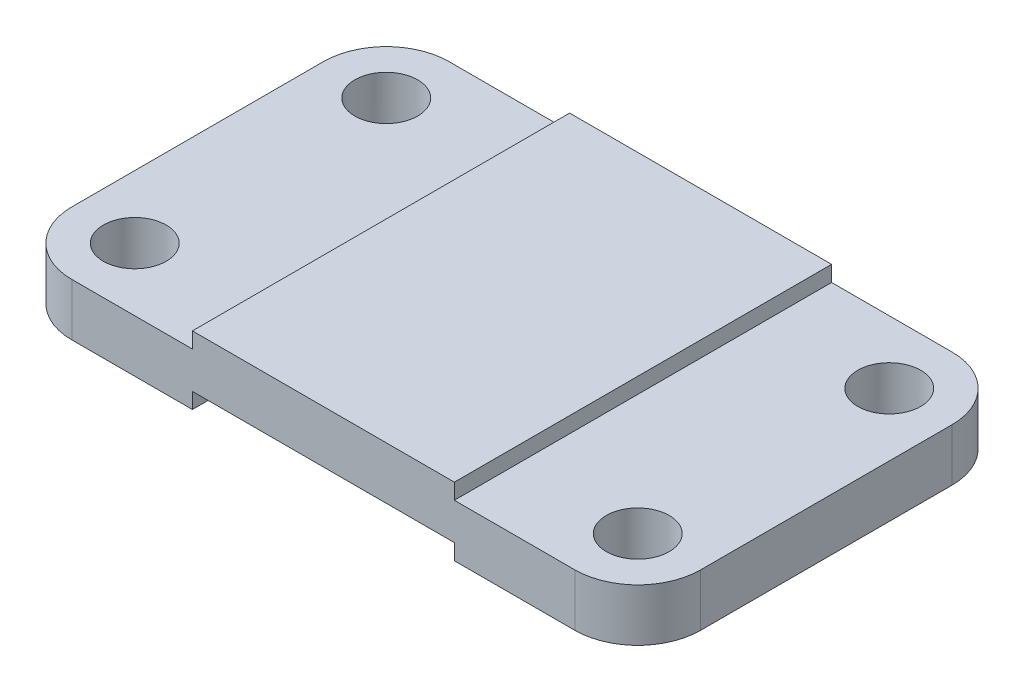
ISO-10303-21;
HEADER;
FILE_DESCRIPTION(('STEP AP214'),'2;1');
FILE_NAME('part.step','',(''),(''),'','','');
FILE_SCHEMA(('AUTOMOTIVE_DESIGN { 1 0 10303 214 1 1 1 1 }'));
ENDSEC;
DATA;
#1=APPLICATION_CONTEXT('core data for automotive mechanical design processes');
#2=APPLICATION_PROTOCOL_DEFINITION('international standard','automotive_design',2000,#1);
#3=PRODUCT_CONTEXT('',#1,'mechanical');
#4=PRODUCT('Part','Part','',(#3));
#5=PRODUCT_RELATED_PRODUCT_CATEGORY('part','',(#4));
#6=PRODUCT_DEFINITION_FORMATION('','',#4);
#7=PRODUCT_DEFINITION_CONTEXT('part definition',#1,'design');
#8=PRODUCT_DEFINITION('design','',#6,#7);
#9=PRODUCT_DEFINITION_SHAPE('','',#8);
#10=(LENGTH_UNIT() NAMED_UNIT(*) SI_UNIT(.MILLI.,.METRE.));
#11=(NAMED_UNIT(*) PLANE_ANGLE_UNIT() SI_UNIT($,.RADIAN.));
#12=(NAMED_UNIT(*) SI_UNIT($,.STERADIAN.) SOLID_ANGLE_UNIT());
#13=UNCERTAINTY_MEASURE_WITH_UNIT(LENGTH_MEASURE(1.E-05),#10,'distance_accuracy_value','');
#14=(GEOMETRIC_REPRESENTATION_CONTEXT(3) GLOBAL_UNCERTAINTY_ASSIGNED_CONTEXT((#13)) GLOBAL_UNIT_ASSIGNED_CONTEXT((#10,
#11,#12)) REPRESENTATION_CONTEXT('',''));
#15=CARTESIAN_POINT('',(0.,0.,0.));
#16=DIRECTION('',(0.,0.,1.));
#17=DIRECTION('',(1.,0.,0.));
#18=AXIS2_PLACEMENT_3D('',#15,#16,#17);
#19=CARTESIAN_POINT('',(-48.,0.,24.));
#20=DIRECTION('',(0.,-1.,0.));
#21=DIRECTION('',(0.,0.,-1.));
#22=AXIS2_PLACEMENT_3D('',#19,#20,#21);
#23=PLANE('',#22);
#24=CARTESIAN_POINT('',(-48.,0.,-24.));
#25=DIRECTION('',(0.,-1.,0.));
#26=DIRECTION('',(0.,0.,-1.));
#27=AXIS2_PLACEMENT_3D('',#24,#25,#26);
#28=CIRCLE('',#27,6.);
#29=CARTESIAN_POINT('',(-48.,0.,-30.));
#30=VERTEX_POINT('',#29);
#31=EDGE_CURVE('E227',#30,#30,#28,.T.);
#32=ORIENTED_EDGE('',*,*,#31,.F.);
#33=EDGE_LOOP('',(#32));
#34=FACE_BOUND('',#33,.T.);
#35=CARTESIAN_POINT('',(-48.,0.,24.));
#36=DIRECTION('',(0.,-1.,0.));
#37=DIRECTION('',(0.,0.,-1.));
#38=AXIS2_PLACEMENT_3D('',#35,#36,#37);
#39=CIRCLE('',#38,6.);
#40=CARTESIAN_POINT('',(-48.,0.,18.));
#41=VERTEX_POINT('',#40);
#42=EDGE_CURVE('E221',#41,#41,#39,.T.);
#43=ORIENTED_EDGE('',*,*,#42,.F.);
#44=EDGE_LOOP('',(#43));
#45=FACE_BOUND('',#44,.T.);
#46=DIRECTION('',(0.,0.,-1.));
#47=VECTOR('',#46,1.);
#48=CARTESIAN_POINT('',(-25.,0.,-36.));
#49=LINE('',#48,#47);
#50=CARTESIAN_POINT('',(-25.,0.,36.));
#51=VERTEX_POINT('',#50);
#52=CARTESIAN_POINT('',(-25.,0.,-36.));
#53=VERTEX_POINT('',#52);
#54=EDGE_CURVE('E153',#51,#53,#49,.T.);
#55=ORIENTED_EDGE('',*,*,#54,.F.);
#56=DIRECTION('',(1.,0.,0.));
#57=VECTOR('',#56,1.);
#58=CARTESIAN_POINT('',(47.9999999999999,0.,36.));
#59=LINE('',#58,#57);
#60=CARTESIAN_POINT('',(-47.9999999999999,0.,36.));
#61=VERTEX_POINT('',#60);
#62=EDGE_CURVE('E363',#61,#51,#59,.T.);
#63=ORIENTED_EDGE('',*,*,#62,.F.);
#64=CARTESIAN_POINT('',(-48.,0.,24.));
#65=DIRECTION('',(0.,1.,0.));
#66=DIRECTION('',(0.,0.,-1.));
#67=AXIS2_PLACEMENT_3D('',#64,#65,#66);
#68=CIRCLE('',#67,12.);
#69=CARTESIAN_POINT('',(-60.,0.,23.9999999999999));
#70=VERTEX_POINT('',#69);
#71=EDGE_CURVE('E359',#70,#61,#68,.T.);
#72=ORIENTED_EDGE('',*,*,#71,.F.);
#73=DIRECTION('',(0.,0.,1.));
#74=VECTOR('',#73,1.);
#75=CARTESIAN_POINT('',(-60.,0.,23.9999999999999));
#76=LINE('',#75,#74);
#77=CARTESIAN_POINT('',(-60.,0.,-23.9999999999999));
#78=VERTEX_POINT('',#77);
#79=EDGE_CURVE('E295',#78,#70,#76,.T.);
#80=ORIENTED_EDGE('',*,*,#79,.F.);
#81=CARTESIAN_POINT('',(-48.,0.,-24.));
#82=DIRECTION('',(0.,1.,0.));
#83=DIRECTION('',(0.,0.,1.));
#84=AXIS2_PLACEMENT_3D('',#81,#82,#83);
#85=CIRCLE('',#84,12.);
#86=CARTESIAN_POINT('',(-47.9999999999999,0.,-36.));
#87=VERTEX_POINT('',#86);
#88=EDGE_CURVE('E292',#87,#78,#85,.T.);
#89=ORIENTED_EDGE('',*,*,#88,.F.);
#90=DIRECTION('',(-1.,0.,0.));
#91=VECTOR('',#90,1.);
#92=CARTESIAN_POINT('',(-47.9999999999999,0.,-36.));
#93=LINE('',#92,#91);
#94=EDGE_CURVE('E293',#53,#87,#93,.T.);
#95=ORIENTED_EDGE('',*,*,#94,.F.);
#96=EDGE_LOOP('',(#55,#63,#72,#80,#89,#95));
#97=FACE_BOUND('',#96,.T.);
#98=ADVANCED_FACE('F33',(#34,#45,#97),#23,.T.);
#99=CARTESIAN_POINT('',(-48.,10.,24.));
#100=DIRECTION('',(0.,-1.,0.));
#101=DIRECTION('',(0.,0.,-1.));
#102=AXIS2_PLACEMENT_3D('',#99,#100,#101);
#103=PLANE('',#102);
#104=CARTESIAN_POINT('',(-48.,10.,-24.));
#105=DIRECTION('',(0.,1.,0.));
#106=DIRECTION('',(0.,0.,1.));
#107=AXIS2_PLACEMENT_3D('',#104,#105,#106);
#108=CIRCLE('',#107,6.);
#109=CARTESIAN_POINT('',(-48.,10.,-18.));
#110=VERTEX_POINT('',#109);
#111=EDGE_CURVE('E230',#110,#110,#108,.T.);
#112=ORIENTED_EDGE('',*,*,#111,.F.);
#113=EDGE_LOOP('',(#112));
#114=FACE_BOUND('',#113,.T.);
#115=CARTESIAN_POINT('',(-48.,10.,24.));
#116=DIRECTION('',(0.,1.,0.));
#117=DIRECTION('',(0.,0.,1.));
#118=AXIS2_PLACEMENT_3D('',#115,#116,#117);
#119=CIRCLE('',#118,6.);
#120=CARTESIAN_POINT('',(-48.,10.,30.));
#121=VERTEX_POINT('',#120);
#122=EDGE_CURVE('E224',#121,#121,#119,.T.);
#123=ORIENTED_EDGE('',*,*,#122,.F.);
#124=EDGE_LOOP('',(#123));
#125=FACE_BOUND('',#124,.T.);
#126=DIRECTION('',(0.,0.,1.));
#127=VECTOR('',#126,1.);
#128=CARTESIAN_POINT('',(-25.,10.,-36.));
#129=LINE('',#128,#127);
#130=CARTESIAN_POINT('',(-25.,10.,-36.));
#131=VERTEX_POINT('',#130);
#132=CARTESIAN_POINT('',(-24.9999999999999,10.,36.));
#133=VERTEX_POINT('',#132);
#134=EDGE_CURVE('E58',#131,#133,#129,.T.);
#135=ORIENTED_EDGE('',*,*,#134,.F.);
#136=DIRECTION('',(-1.,0.,0.));
#137=VECTOR('',#136,1.);
#138=CARTESIAN_POINT('',(-47.9999999999999,10.,-36.));
#139=LINE('',#138,#137);
#140=CARTESIAN_POINT('',(-47.9999999999999,10.,-36.));
#141=VERTEX_POINT('',#140);
#142=EDGE_CURVE('E336',#131,#141,#139,.T.);
#143=ORIENTED_EDGE('',*,*,#142,.T.);
#144=CARTESIAN_POINT('',(-48.,10.,-24.));
#145=DIRECTION('',(0.,1.,0.));
#146=DIRECTION('',(0.,0.,1.));
#147=AXIS2_PLACEMENT_3D('',#144,#145,#146);
#148=CIRCLE('',#147,12.);
#149=CARTESIAN_POINT('',(-60.,10.,-23.9999999999999));
#150=VERTEX_POINT('',#149);
#151=EDGE_CURVE('E339',#141,#150,#148,.T.);
#152=ORIENTED_EDGE('',*,*,#151,.T.);
#153=DIRECTION('',(0.,0.,1.));
#154=VECTOR('',#153,1.);
#155=CARTESIAN_POINT('',(-60.,10.,23.9999999999999));
#156=LINE('',#155,#154);
#157=CARTESIAN_POINT('',(-60.,10.,23.9999999999999));
#158=VERTEX_POINT('',#157);
#159=EDGE_CURVE('E307',#150,#158,#156,.T.);
#160=ORIENTED_EDGE('',*,*,#159,.T.);
#161=CARTESIAN_POINT('',(-48.,10.,24.));
#162=DIRECTION('',(0.,1.,0.));
#163=DIRECTION('',(0.,0.,-1.));
#164=AXIS2_PLACEMENT_3D('',#161,#162,#163);
#165=CIRCLE('',#164,12.);
#166=CARTESIAN_POINT('',(-47.9999999999999,10.,36.));
#167=VERTEX_POINT('',#166);
#168=EDGE_CURVE('E302',#158,#167,#165,.T.);
#169=ORIENTED_EDGE('',*,*,#168,.T.);
#170=DIRECTION('',(1.,0.,0.));
#171=VECTOR('',#170,1.);
#172=CARTESIAN_POINT('',(47.9999999999999,10.,36.));
#173=LINE('',#172,#171);
#174=EDGE_CURVE('E322',#167,#133,#173,.T.);
#175=ORIENTED_EDGE('',*,*,#174,.T.);
#176=EDGE_LOOP('',(#135,#143,#152,#160,#169,#175));
#177=FACE_BOUND('',#176,.T.);
#178=ADVANCED_FACE('F236',(#114,#125,#177),#103,.F.);
#179=CARTESIAN_POINT('',(48.,10.,24.));
#180=DIRECTION('',(0.,1.,0.));
#181=DIRECTION('',(0.,0.,1.));
#182=AXIS2_PLACEMENT_3D('',#179,#180,#181);
#183=CIRCLE('',#182,6.);
#184=CARTESIAN_POINT('',(48.,10.,30.));
#185=VERTEX_POINT('',#184);
#186=EDGE_CURVE('E217',#185,#185,#183,.T.);
#187=ORIENTED_EDGE('',*,*,#186,.F.);
#188=EDGE_LOOP('',(#187));
#189=FACE_BOUND('',#188,.T.);
#190=CARTESIAN_POINT('',(48.,10.,-24.));
#191=DIRECTION('',(0.,1.,0.));
#192=DIRECTION('',(0.,0.,1.));
#193=AXIS2_PLACEMENT_3D('',#190,#191,#192);
#194=CIRCLE('',#193,6.);
#195=CARTESIAN_POINT('',(48.,10.,-18.));
#196=VERTEX_POINT('',#195);
#197=EDGE_CURVE('E210',#196,#196,#194,.T.);
#198=ORIENTED_EDGE('',*,*,#197,.F.);
#199=EDGE_LOOP('',(#198));
#200=FACE_BOUND('',#199,.T.);
#201=DIRECTION('',(0.,0.,-1.));
#202=VECTOR('',#201,1.);
#203=CARTESIAN_POINT('',(25.,10.,36.));
#204=LINE('',#203,#202);
#205=CARTESIAN_POINT('',(25.,10.,36.));
#206=VERTEX_POINT('',#205);
#207=CARTESIAN_POINT('',(25.,10.,-36.));
#208=VERTEX_POINT('',#207);
#209=EDGE_CURVE('E189',#206,#208,#204,.T.);
#210=ORIENTED_EDGE('',*,*,#209,.F.);
#211=CARTESIAN_POINT('',(47.9999999999999,10.,36.));
#212=VERTEX_POINT('',#211);
#213=EDGE_CURVE('E326',#206,#212,#173,.T.);
#214=ORIENTED_EDGE('',*,*,#213,.T.);
#215=CARTESIAN_POINT('',(48.,10.,24.));
#216=DIRECTION('',(0.,1.,0.));
#217=DIRECTION('',(0.,0.,-1.));
#218=AXIS2_PLACEMENT_3D('',#215,#216,#217);
#219=CIRCLE('',#218,12.);
#220=CARTESIAN_POINT('',(60.,10.,23.9999999999999));
#221=VERTEX_POINT('',#220);
#222=EDGE_CURVE('E325',#212,#221,#219,.T.);
#223=ORIENTED_EDGE('',*,*,#222,.T.);
#224=DIRECTION('',(0.,0.,-1.));
#225=VECTOR('',#224,1.);
#226=CARTESIAN_POINT('',(60.,10.,-23.9999999999999));
#227=LINE('',#226,#225);
#228=CARTESIAN_POINT('',(60.,10.,-23.9999999999999));
#229=VERTEX_POINT('',#228);
#230=EDGE_CURVE('E332',#221,#229,#227,.T.);
#231=ORIENTED_EDGE('',*,*,#230,.T.);
#232=CARTESIAN_POINT('',(48.,10.,-24.));
#233=DIRECTION('',(0.,1.,0.));
#234=DIRECTION('',(0.,0.,-1.));
#235=AXIS2_PLACEMENT_3D('',#232,#233,#234);
#236=CIRCLE('',#235,12.);
#237=CARTESIAN_POINT('',(47.9999999999999,10.,-36.));
#238=VERTEX_POINT('',#237);
#239=EDGE_CURVE('E334',#229,#238,#236,.T.);
#240=ORIENTED_EDGE('',*,*,#239,.T.);
#241=EDGE_CURVE('E344',#238,#208,#139,.T.);
#242=ORIENTED_EDGE('',*,*,#241,.T.);
#243=EDGE_LOOP('',(#210,#214,#223,#231,#240,#242));
#244=FACE_BOUND('',#243,.T.);
#245=ADVANCED_FACE('F239',(#189,#200,#244),#103,.F.);
#246=CARTESIAN_POINT('',(-48.,10.,24.));
#247=DIRECTION('',(0.,-1.,0.));
#248=DIRECTION('',(0.,0.,-1.));
#249=AXIS2_PLACEMENT_3D('',#246,#247,#248);
#250=CYLINDRICAL_SURFACE('',#249,12.);
#251=ORIENTED_EDGE('',*,*,#71,.T.);
#252=DIRECTION('',(0.,-1.,0.));
#253=VECTOR('',#252,1.);
#254=CARTESIAN_POINT('',(-47.9999999999999,10.,36.));
#255=LINE('',#254,#253);
#256=EDGE_CURVE('E11',#167,#61,#255,.T.);
#257=ORIENTED_EDGE('',*,*,#256,.F.);
#258=ORIENTED_EDGE('',*,*,#168,.F.);
#259=DIRECTION('',(0.,-1.,0.));
#260=VECTOR('',#259,1.);
#261=CARTESIAN_POINT('',(-60.,10.,23.9999999999999));
#262=LINE('',#261,#260);
#263=EDGE_CURVE('E303',#158,#70,#262,.T.);
#264=ORIENTED_EDGE('',*,*,#263,.T.);
#265=EDGE_LOOP('',(#251,#257,#258,#264));
#266=FACE_BOUND('',#265,.T.);
#267=ADVANCED_FACE('F35',(#266),#250,.T.);
#268=CARTESIAN_POINT('',(47.9999999999999,10.,36.));
#269=DIRECTION('',(0.,0.,-1.));
#270=DIRECTION('',(-1.,0.,0.));
#271=AXIS2_PLACEMENT_3D('',#268,#269,#270);
#272=PLANE('',#271);
#273=ORIENTED_EDGE('',*,*,#62,.T.);
#274=DIRECTION('',(0.,-1.,0.));
#275=VECTOR('',#274,1.);
#276=CARTESIAN_POINT('',(-25.,3.,36.));
#277=LINE('',#276,#275);
#278=CARTESIAN_POINT('',(-25.,3.,36.));
#279=VERTEX_POINT('',#278);
#280=EDGE_CURVE('E179',#279,#51,#277,.T.);
#281=ORIENTED_EDGE('',*,*,#280,.F.);
#282=DIRECTION('',(-1.,0.,0.));
#283=VECTOR('',#282,1.);
#284=CARTESIAN_POINT('',(-25.,3.,36.));
#285=LINE('',#284,#283);
#286=CARTESIAN_POINT('',(25.,3.,36.));
#287=VERTEX_POINT('',#286);
#288=EDGE_CURVE('E157',#287,#279,#285,.T.);
#289=ORIENTED_EDGE('',*,*,#288,.F.);
#290=DIRECTION('',(0.,-1.,0.));
#291=VECTOR('',#290,1.);
#292=CARTESIAN_POINT('',(25.,3.,36.));
#293=LINE('',#292,#291);
#294=CARTESIAN_POINT('',(25.,0.,36.));
#295=VERTEX_POINT('',#294);
#296=EDGE_CURVE('E181',#287,#295,#293,.T.);
#297=ORIENTED_EDGE('',*,*,#296,.T.);
#298=CARTESIAN_POINT('',(47.9999999999999,0.,36.));
#299=VERTEX_POINT('',#298);
#300=EDGE_CURVE('E287',#295,#299,#59,.T.);
#301=ORIENTED_EDGE('',*,*,#300,.T.);
#302=DIRECTION('',(0.,-1.,0.));
#303=VECTOR('',#302,1.);
#304=CARTESIAN_POINT('',(47.9999999999999,10.,36.));
#305=LINE('',#304,#303);
#306=EDGE_CURVE('E42',#212,#299,#305,.T.);
#307=ORIENTED_EDGE('',*,*,#306,.F.);
#308=ORIENTED_EDGE('',*,*,#213,.F.);
#309=DIRECTION('',(0.,-1.,0.));
#310=VECTOR('',#309,1.);
#311=CARTESIAN_POINT('',(25.,13.,36.));
#312=LINE('',#311,#310);
#313=CARTESIAN_POINT('',(25.,13.,36.));
#314=VERTEX_POINT('',#313);
#315=EDGE_CURVE('E409',#314,#206,#312,.T.);
#316=ORIENTED_EDGE('',*,*,#315,.F.);
#317=DIRECTION('',(1.,0.,0.));
#318=VECTOR('',#317,1.);
#319=CARTESIAN_POINT('',(-25.,13.,36.));
#320=LINE('',#319,#318);
#321=CARTESIAN_POINT('',(-25.,13.,36.));
#322=VERTEX_POINT('',#321);
#323=EDGE_CURVE('E188',#322,#314,#320,.T.);
#324=ORIENTED_EDGE('',*,*,#323,.F.);
#325=DIRECTION('',(0.,-1.,0.));
#326=VECTOR('',#325,1.);
#327=CARTESIAN_POINT('',(-25.,13.,36.));
#328=LINE('',#327,#326);
#329=EDGE_CURVE('E362',#322,#133,#328,.T.);
#330=ORIENTED_EDGE('',*,*,#329,.T.);
#331=ORIENTED_EDGE('',*,*,#174,.F.);
#332=ORIENTED_EDGE('',*,*,#256,.T.);
#333=EDGE_LOOP('',(#273,#281,#289,#297,#301,#307,#308,#316,#324,#330,#331,#332));
#334=FACE_BOUND('',#333,.T.);
#335=ADVANCED_FACE('F385',(#334),#272,.F.);
#336=CARTESIAN_POINT('',(48.,10.,24.));
#337=DIRECTION('',(0.,-1.,0.));
#338=DIRECTION('',(0.,0.,-1.));
#339=AXIS2_PLACEMENT_3D('',#336,#337,#338);
#340=CYLINDRICAL_SURFACE('',#339,12.);
#341=CARTESIAN_POINT('',(48.,0.,24.));
#342=DIRECTION('',(0.,1.,0.));
#343=DIRECTION('',(0.,0.,-1.));
#344=AXIS2_PLACEMENT_3D('',#341,#342,#343);
#345=CIRCLE('',#344,12.);
#346=CARTESIAN_POINT('',(60.,0.,23.9999999999999));
#347=VERTEX_POINT('',#346);
#348=EDGE_CURVE('E366',#299,#347,#345,.T.);
#349=ORIENTED_EDGE('',*,*,#348,.T.);
#350=DIRECTION('',(0.,-1.,0.));
#351=VECTOR('',#350,1.);
#352=CARTESIAN_POINT('',(60.,10.,23.9999999999999));
#353=LINE('',#352,#351);
#354=EDGE_CURVE('E317',#221,#347,#353,.T.);
#355=ORIENTED_EDGE('',*,*,#354,.F.);
#356=ORIENTED_EDGE('',*,*,#222,.F.);
#357=ORIENTED_EDGE('',*,*,#306,.T.);
#358=EDGE_LOOP('',(#349,#355,#356,#357));
#359=FACE_BOUND('',#358,.T.);
#360=ADVANCED_FACE('F376',(#359),#340,.T.);
#361=CARTESIAN_POINT('',(60.,10.,-23.9999999999999));
#362=DIRECTION('',(-1.,0.,0.));
#363=DIRECTION('',(0.,0.,1.));
#364=AXIS2_PLACEMENT_3D('',#361,#362,#363);
#365=PLANE('',#364);
#366=DIRECTION('',(0.,0.,-1.));
#367=VECTOR('',#366,1.);
#368=CARTESIAN_POINT('',(60.,0.,-23.9999999999999));
#369=LINE('',#368,#367);
#370=CARTESIAN_POINT('',(60.,0.,-23.9999999999999));
#371=VERTEX_POINT('',#370);
#372=EDGE_CURVE('E367',#347,#371,#369,.T.);
#373=ORIENTED_EDGE('',*,*,#372,.T.);
#374=DIRECTION('',(0.,-1.,0.));
#375=VECTOR('',#374,1.);
#376=CARTESIAN_POINT('',(60.,10.,-23.9999999999999));
#377=LINE('',#376,#375);
#378=EDGE_CURVE('E314',#229,#371,#377,.T.);
#379=ORIENTED_EDGE('',*,*,#378,.F.);
#380=ORIENTED_EDGE('',*,*,#230,.F.);
#381=ORIENTED_EDGE('',*,*,#354,.T.);
#382=EDGE_LOOP('',(#373,#379,#380,#381));
#383=FACE_BOUND('',#382,.T.);
#384=ADVANCED_FACE('F380',(#383),#365,.F.);
#385=CARTESIAN_POINT('',(48.,10.,-24.));
#386=DIRECTION('',(0.,-1.,0.));
#387=DIRECTION('',(0.,0.,-1.));
#388=AXIS2_PLACEMENT_3D('',#385,#386,#387);
#389=CYLINDRICAL_SURFACE('',#388,12.);
#390=CARTESIAN_POINT('',(48.,0.,-24.));
#391=DIRECTION('',(0.,1.,0.));
#392=DIRECTION('',(0.,0.,-1.));
#393=AXIS2_PLACEMENT_3D('',#390,#391,#392);
#394=CIRCLE('',#393,12.);
#395=CARTESIAN_POINT('',(47.9999999999999,0.,-36.));
#396=VERTEX_POINT('',#395);
#397=EDGE_CURVE('E297',#371,#396,#394,.T.);
#398=ORIENTED_EDGE('',*,*,#397,.T.);
#399=DIRECTION('',(0.,-1.,0.));
#400=VECTOR('',#399,1.);
#401=CARTESIAN_POINT('',(47.9999999999999,10.,-36.));
#402=LINE('',#401,#400);
#403=EDGE_CURVE('E291',#238,#396,#402,.T.);
#404=ORIENTED_EDGE('',*,*,#403,.F.);
#405=ORIENTED_EDGE('',*,*,#239,.F.);
#406=ORIENTED_EDGE('',*,*,#378,.T.);
#407=EDGE_LOOP('',(#398,#404,#405,#406));
#408=FACE_BOUND('',#407,.T.);
#409=ADVANCED_FACE('F372',(#408),#389,.T.);
#410=CARTESIAN_POINT('',(-47.9999999999999,10.,-36.));
#411=DIRECTION('',(0.,0.,1.));
#412=DIRECTION('',(1.,0.,0.));
#413=AXIS2_PLACEMENT_3D('',#410,#411,#412);
#414=PLANE('',#413);
#415=DIRECTION('',(1.,0.,0.));
#416=VECTOR('',#415,1.);
#417=CARTESIAN_POINT('',(25.,3.,-36.));
#418=LINE('',#417,#416);
#419=CARTESIAN_POINT('',(-25.,3.,-36.));
#420=VERTEX_POINT('',#419);
#421=CARTESIAN_POINT('',(25.,3.,-36.));
#422=VERTEX_POINT('',#421);
#423=EDGE_CURVE('E163',#420,#422,#418,.T.);
#424=ORIENTED_EDGE('',*,*,#423,.F.);
#425=DIRECTION('',(0.,-1.,0.));
#426=VECTOR('',#425,1.);
#427=CARTESIAN_POINT('',(-25.,3.,-36.));
#428=LINE('',#427,#426);
#429=EDGE_CURVE('E147',#420,#53,#428,.T.);
#430=ORIENTED_EDGE('',*,*,#429,.T.);
#431=ORIENTED_EDGE('',*,*,#94,.T.);
#432=DIRECTION('',(0.,-1.,0.));
#433=VECTOR('',#432,1.);
#434=CARTESIAN_POINT('',(-47.9999999999999,10.,-36.));
#435=LINE('',#434,#433);
#436=EDGE_CURVE('E310',#141,#87,#435,.T.);
#437=ORIENTED_EDGE('',*,*,#436,.F.);
#438=ORIENTED_EDGE('',*,*,#142,.F.);
#439=DIRECTION('',(0.,-1.,0.));
#440=VECTOR('',#439,1.);
#441=CARTESIAN_POINT('',(-25.,13.,-36.));
#442=LINE('',#441,#440);
#443=CARTESIAN_POINT('',(-25.,13.,-36.));
#444=VERTEX_POINT('',#443);
#445=EDGE_CURVE('E195',#444,#131,#442,.T.);
#446=ORIENTED_EDGE('',*,*,#445,.F.);
#447=DIRECTION('',(-1.,0.,0.));
#448=VECTOR('',#447,1.);
#449=CARTESIAN_POINT('',(25.,13.,-36.));
#450=LINE('',#449,#448);
#451=CARTESIAN_POINT('',(25.,13.,-36.));
#452=VERTEX_POINT('',#451);
#453=EDGE_CURVE('E193',#452,#444,#450,.T.);
#454=ORIENTED_EDGE('',*,*,#453,.F.);
#455=DIRECTION('',(0.,-1.,0.));
#456=VECTOR('',#455,1.);
#457=CARTESIAN_POINT('',(25.,13.,-36.));
#458=LINE('',#457,#456);
#459=EDGE_CURVE('E207',#452,#208,#458,.T.);
#460=ORIENTED_EDGE('',*,*,#459,.T.);
#461=ORIENTED_EDGE('',*,*,#241,.F.);
#462=ORIENTED_EDGE('',*,*,#403,.T.);
#463=CARTESIAN_POINT('',(25.,0.,-36.));
#464=VERTEX_POINT('',#463);
#465=EDGE_CURVE('E285',#396,#464,#93,.T.);
#466=ORIENTED_EDGE('',*,*,#465,.T.);
#467=DIRECTION('',(0.,-1.,0.));
#468=VECTOR('',#467,1.);
#469=CARTESIAN_POINT('',(25.,3.,-36.));
#470=LINE('',#469,#468);
#471=EDGE_CURVE('E50',#422,#464,#470,.T.);
#472=ORIENTED_EDGE('',*,*,#471,.F.);
#473=EDGE_LOOP('',(#424,#430,#431,#437,#438,#446,#454,#460,#461,#462,#466,#472));
#474=FACE_BOUND('',#473,.T.);
#475=ADVANCED_FACE('F168',(#474),#414,.F.);
#476=CARTESIAN_POINT('',(-48.,10.,-24.));
#477=DIRECTION('',(0.,-1.,0.));
#478=DIRECTION('',(0.,0.,-1.));
#479=AXIS2_PLACEMENT_3D('',#476,#477,#478);
#480=CYLINDRICAL_SURFACE('',#479,12.);
#481=ORIENTED_EDGE('',*,*,#88,.T.);
#482=DIRECTION('',(0.,-1.,0.));
#483=VECTOR('',#482,1.);
#484=CARTESIAN_POINT('',(-60.,10.,-23.9999999999999));
#485=LINE('',#484,#483);
#486=EDGE_CURVE('E306',#150,#78,#485,.T.);
#487=ORIENTED_EDGE('',*,*,#486,.F.);
#488=ORIENTED_EDGE('',*,*,#151,.F.);
#489=ORIENTED_EDGE('',*,*,#436,.T.);
#490=EDGE_LOOP('',(#481,#487,#488,#489));
#491=FACE_BOUND('',#490,.T.);
#492=ADVANCED_FACE('F277',(#491),#480,.T.);
#493=CARTESIAN_POINT('',(-60.,10.,23.9999999999999));
#494=DIRECTION('',(1.,0.,0.));
#495=DIRECTION('',(0.,0.,-1.));
#496=AXIS2_PLACEMENT_3D('',#493,#494,#495);
#497=PLANE('',#496);
#498=ORIENTED_EDGE('',*,*,#79,.T.);
#499=ORIENTED_EDGE('',*,*,#263,.F.);
#500=ORIENTED_EDGE('',*,*,#159,.F.);
#501=ORIENTED_EDGE('',*,*,#486,.T.);
#502=EDGE_LOOP('',(#498,#499,#500,#501));
#503=FACE_BOUND('',#502,.T.);
#504=ADVANCED_FACE('F268',(#503),#497,.F.);
#505=CARTESIAN_POINT('',(48.,0.,24.));
#506=DIRECTION('',(0.,-1.,0.));
#507=DIRECTION('',(0.,0.,-1.));
#508=AXIS2_PLACEMENT_3D('',#505,#506,#507);
#509=CIRCLE('',#508,6.);
#510=CARTESIAN_POINT('',(48.,0.,18.));
#511=VERTEX_POINT('',#510);
#512=EDGE_CURVE('E37',#511,#511,#509,.T.);
#513=ORIENTED_EDGE('',*,*,#512,.F.);
#514=EDGE_LOOP('',(#513));
#515=FACE_BOUND('',#514,.T.);
#516=CARTESIAN_POINT('',(48.,0.,-24.));
#517=DIRECTION('',(0.,-1.,0.));
#518=DIRECTION('',(0.,0.,-1.));
#519=AXIS2_PLACEMENT_3D('',#516,#517,#518);
#520=CIRCLE('',#519,6.);
#521=CARTESIAN_POINT('',(48.,0.,-30.));
#522=VERTEX_POINT('',#521);
#523=EDGE_CURVE('E177',#522,#522,#520,.T.);
#524=ORIENTED_EDGE('',*,*,#523,.F.);
#525=EDGE_LOOP('',(#524));
#526=FACE_BOUND('',#525,.T.);
#527=DIRECTION('',(0.,0.,1.));
#528=VECTOR('',#527,1.);
#529=CARTESIAN_POINT('',(25.,0.,36.));
#530=LINE('',#529,#528);
#531=EDGE_CURVE('E166',#464,#295,#530,.T.);
#532=ORIENTED_EDGE('',*,*,#531,.F.);
#533=ORIENTED_EDGE('',*,*,#465,.F.);
#534=ORIENTED_EDGE('',*,*,#397,.F.);
#535=ORIENTED_EDGE('',*,*,#372,.F.);
#536=ORIENTED_EDGE('',*,*,#348,.F.);
#537=ORIENTED_EDGE('',*,*,#300,.F.);
#538=EDGE_LOOP('',(#532,#533,#534,#535,#536,#537));
#539=FACE_BOUND('',#538,.T.);
#540=ADVANCED_FACE('F260',(#515,#526,#539),#23,.T.);
#541=CARTESIAN_POINT('',(-25.,13.,-36.));
#542=DIRECTION('',(1.,0.,0.));
#543=DIRECTION('',(0.,0.,-1.));
#544=AXIS2_PLACEMENT_3D('',#541,#542,#543);
#545=PLANE('',#544);
#546=ORIENTED_EDGE('',*,*,#134,.T.);
#547=ORIENTED_EDGE('',*,*,#329,.F.);
#548=DIRECTION('',(0.,0.,1.));
#549=VECTOR('',#548,1.);
#550=CARTESIAN_POINT('',(-25.,13.,-36.));
#551=LINE('',#550,#549);
#552=EDGE_CURVE('E185',#444,#322,#551,.T.);
#553=ORIENTED_EDGE('',*,*,#552,.F.);
#554=ORIENTED_EDGE('',*,*,#445,.T.);
#555=EDGE_LOOP('',(#546,#547,#553,#554));
#556=FACE_BOUND('',#555,.T.);
#557=ADVANCED_FACE('F267',(#556),#545,.F.);
#558=CARTESIAN_POINT('',(25.,13.,36.));
#559=DIRECTION('',(-1.,0.,0.));
#560=DIRECTION('',(0.,0.,1.));
#561=AXIS2_PLACEMENT_3D('',#558,#559,#560);
#562=PLANE('',#561);
#563=ORIENTED_EDGE('',*,*,#209,.T.);
#564=ORIENTED_EDGE('',*,*,#459,.F.);
#565=DIRECTION('',(0.,0.,-1.));
#566=VECTOR('',#565,1.);
#567=CARTESIAN_POINT('',(25.,13.,36.));
#568=LINE('',#567,#566);
#569=EDGE_CURVE('E191',#314,#452,#568,.T.);
#570=ORIENTED_EDGE('',*,*,#569,.F.);
#571=ORIENTED_EDGE('',*,*,#315,.T.);
#572=EDGE_LOOP('',(#563,#564,#570,#571));
#573=FACE_BOUND('',#572,.T.);
#574=ADVANCED_FACE('F274',(#573),#562,.F.);
#575=CARTESIAN_POINT('',(0.,13.,0.));
#576=DIRECTION('',(0.,1.,0.));
#577=DIRECTION('',(0.,0.,1.));
#578=AXIS2_PLACEMENT_3D('',#575,#576,#577);
#579=PLANE('',#578);
#580=ORIENTED_EDGE('',*,*,#552,.T.);
#581=ORIENTED_EDGE('',*,*,#323,.T.);
#582=ORIENTED_EDGE('',*,*,#569,.T.);
#583=ORIENTED_EDGE('',*,*,#453,.T.);
#584=EDGE_LOOP('',(#580,#581,#582,#583));
#585=FACE_BOUND('',#584,.T.);
#586=ADVANCED_FACE('F394',(#585),#579,.T.);
#587=CARTESIAN_POINT('',(-25.,3.,-36.));
#588=DIRECTION('',(-1.,0.,0.));
#589=DIRECTION('',(0.,0.,1.));
#590=AXIS2_PLACEMENT_3D('',#587,#588,#589);
#591=PLANE('',#590);
#592=ORIENTED_EDGE('',*,*,#54,.T.);
#593=ORIENTED_EDGE('',*,*,#429,.F.);
#594=DIRECTION('',(0.,0.,-1.));
#595=VECTOR('',#594,1.);
#596=CARTESIAN_POINT('',(-25.,3.,-36.));
#597=LINE('',#596,#595);
#598=EDGE_CURVE('E150',#279,#420,#597,.T.);
#599=ORIENTED_EDGE('',*,*,#598,.F.);
#600=ORIENTED_EDGE('',*,*,#280,.T.);
#601=EDGE_LOOP('',(#592,#593,#599,#600));
#602=FACE_BOUND('',#601,.T.);
#603=ADVANCED_FACE('F149',(#602),#591,.F.);
#604=CARTESIAN_POINT('',(25.,3.,36.));
#605=DIRECTION('',(1.,0.,0.));
#606=DIRECTION('',(0.,0.,-1.));
#607=AXIS2_PLACEMENT_3D('',#604,#605,#606);
#608=PLANE('',#607);
#609=ORIENTED_EDGE('',*,*,#531,.T.);
#610=ORIENTED_EDGE('',*,*,#296,.F.);
#611=DIRECTION('',(0.,0.,1.));
#612=VECTOR('',#611,1.);
#613=CARTESIAN_POINT('',(25.,3.,36.));
#614=LINE('',#613,#612);
#615=EDGE_CURVE('E170',#422,#287,#614,.T.);
#616=ORIENTED_EDGE('',*,*,#615,.F.);
#617=ORIENTED_EDGE('',*,*,#471,.T.);
#618=EDGE_LOOP('',(#609,#610,#616,#617));
#619=FACE_BOUND('',#618,.T.);
#620=ADVANCED_FACE('F386',(#619),#608,.F.);
#621=CARTESIAN_POINT('',(0.,3.,0.));
#622=DIRECTION('',(0.,1.,0.));
#623=DIRECTION('',(0.,0.,1.));
#624=AXIS2_PLACEMENT_3D('',#621,#622,#623);
#625=PLANE('',#624);
#626=ORIENTED_EDGE('',*,*,#598,.T.);
#627=ORIENTED_EDGE('',*,*,#423,.T.);
#628=ORIENTED_EDGE('',*,*,#615,.T.);
#629=ORIENTED_EDGE('',*,*,#288,.T.);
#630=EDGE_LOOP('',(#626,#627,#628,#629));
#631=FACE_BOUND('',#630,.T.);
#632=ADVANCED_FACE('F161',(#631),#625,.F.);
#633=CARTESIAN_POINT('',(48.,-39.,-24.));
#634=DIRECTION('',(0.,1.,0.));
#635=DIRECTION('',(0.,0.,1.));
#636=AXIS2_PLACEMENT_3D('',#633,#634,#635);
#637=CYLINDRICAL_SURFACE('',#636,6.);
#638=ORIENTED_EDGE('',*,*,#523,.T.);
#639=EDGE_LOOP('',(#638));
#640=FACE_BOUND('',#639,.T.);
#641=ORIENTED_EDGE('',*,*,#197,.T.);
#642=EDGE_LOOP('',(#641));
#643=FACE_BOUND('',#642,.T.);
#644=ADVANCED_FACE('F254',(#640,#643),#637,.F.);
#645=CARTESIAN_POINT('',(48.,-39.,24.));
#646=DIRECTION('',(0.,1.,0.));
#647=DIRECTION('',(0.,0.,1.));
#648=AXIS2_PLACEMENT_3D('',#645,#646,#647);
#649=CYLINDRICAL_SURFACE('',#648,6.);
#650=ORIENTED_EDGE('',*,*,#512,.T.);
#651=EDGE_LOOP('',(#650));
#652=FACE_BOUND('',#651,.T.);
#653=ORIENTED_EDGE('',*,*,#186,.T.);
#654=EDGE_LOOP('',(#653));
#655=FACE_BOUND('',#654,.T.);
#656=ADVANCED_FACE('F245',(#652,#655),#649,.F.);
#657=CARTESIAN_POINT('',(-48.,-39.,24.));
#658=DIRECTION('',(0.,1.,0.));
#659=DIRECTION('',(0.,0.,1.));
#660=AXIS2_PLACEMENT_3D('',#657,#658,#659);
#661=CYLINDRICAL_SURFACE('',#660,6.);
#662=ORIENTED_EDGE('',*,*,#42,.T.);
#663=EDGE_LOOP('',(#662));
#664=FACE_BOUND('',#663,.T.);
#665=ORIENTED_EDGE('',*,*,#122,.T.);
#666=EDGE_LOOP('',(#665));
#667=FACE_BOUND('',#666,.T.);
#668=ADVANCED_FACE('F243',(#664,#667),#661,.F.);
#669=CARTESIAN_POINT('',(-48.,-39.,-24.));
#670=DIRECTION('',(0.,1.,0.));
#671=DIRECTION('',(0.,0.,1.));
#672=AXIS2_PLACEMENT_3D('',#669,#670,#671);
#673=CYLINDRICAL_SURFACE('',#672,6.);
#674=ORIENTED_EDGE('',*,*,#31,.T.);
#675=EDGE_LOOP('',(#674));
#676=FACE_BOUND('',#675,.T.);
#677=ORIENTED_EDGE('',*,*,#111,.T.);
#678=EDGE_LOOP('',(#677));
#679=FACE_BOUND('',#678,.T.);
#680=ADVANCED_FACE('F234',(#676,#679),#673,.F.);
#681=CLOSED_SHELL('',(#98,#178,#245,#267,#335,#360,#384,#409,#475,#492,#504,#540,#557,#574,#586,
#603,#620,#632,#644,#656,#668,#680));
#682=MANIFOLD_SOLID_BREP('B2',#681);
#683=ADVANCED_BREP_SHAPE_REPRESENTATION('',(#18,#682),#14);
#684=SHAPE_DEFINITION_REPRESENTATION(#9,#683);
ENDSEC;
END-ISO-10303-21;
